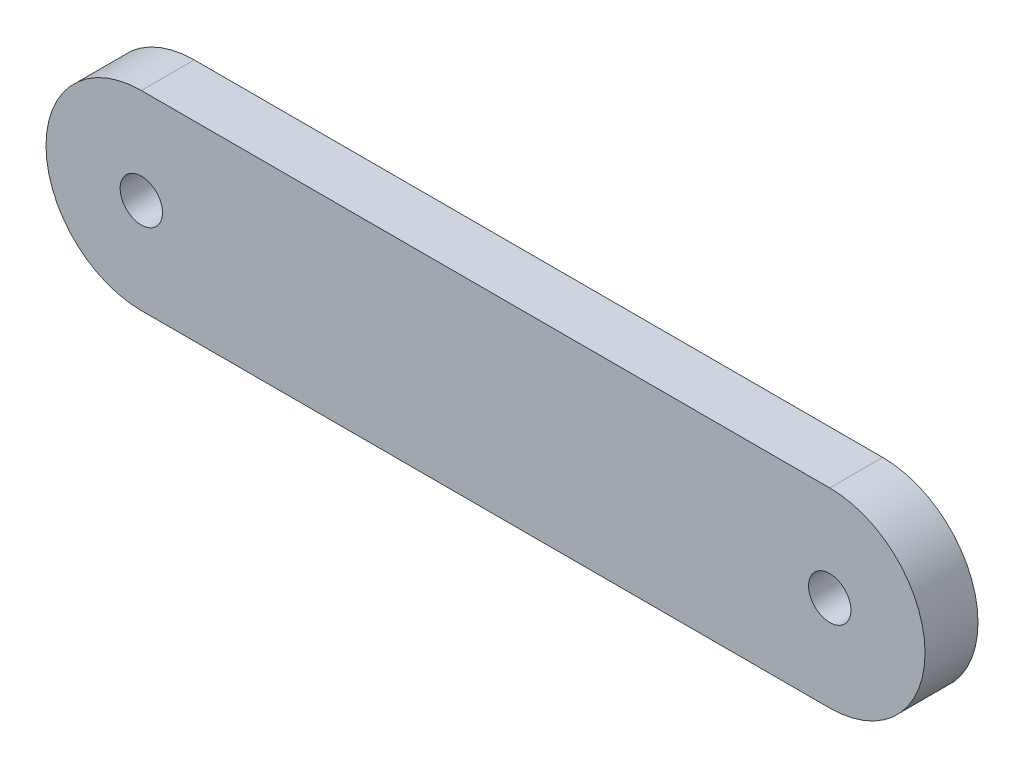
ISO-10303-21;
HEADER;
FILE_DESCRIPTION(('STEP AP214'),'2;1');
FILE_NAME('part.step','',(''),(''),'','','');
FILE_SCHEMA(('AUTOMOTIVE_DESIGN { 1 0 10303 214 1 1 1 1 }'));
ENDSEC;
DATA;
#1=APPLICATION_CONTEXT('core data for automotive mechanical design processes');
#2=APPLICATION_PROTOCOL_DEFINITION('international standard','automotive_design',2000,#1);
#3=PRODUCT_CONTEXT('',#1,'mechanical');
#4=PRODUCT('Part','Part','',(#3));
#5=PRODUCT_RELATED_PRODUCT_CATEGORY('part','',(#4));
#6=PRODUCT_DEFINITION_FORMATION('','',#4);
#7=PRODUCT_DEFINITION_CONTEXT('part definition',#1,'design');
#8=PRODUCT_DEFINITION('design','',#6,#7);
#9=PRODUCT_DEFINITION_SHAPE('','',#8);
#10=(LENGTH_UNIT() NAMED_UNIT(*) SI_UNIT(.MILLI.,.METRE.));
#11=(NAMED_UNIT(*) PLANE_ANGLE_UNIT() SI_UNIT($,.RADIAN.));
#12=(NAMED_UNIT(*) SI_UNIT($,.STERADIAN.) SOLID_ANGLE_UNIT());
#13=UNCERTAINTY_MEASURE_WITH_UNIT(LENGTH_MEASURE(1.E-05),#10,'distance_accuracy_value','');
#14=(GEOMETRIC_REPRESENTATION_CONTEXT(3) GLOBAL_UNCERTAINTY_ASSIGNED_CONTEXT((#13)) GLOBAL_UNIT_ASSIGNED_CONTEXT((#10,
#11,#12)) REPRESENTATION_CONTEXT('',''));
#15=CARTESIAN_POINT('',(0.,0.,0.));
#16=DIRECTION('',(0.,0.,1.));
#17=DIRECTION('',(1.,0.,0.));
#18=AXIS2_PLACEMENT_3D('',#15,#16,#17);
#19=CARTESIAN_POINT('',(0.,0.,5.));
#20=DIRECTION('',(0.,0.,1.));
#21=DIRECTION('',(1.,0.,0.));
#22=AXIS2_PLACEMENT_3D('',#19,#20,#21);
#23=PLANE('',#22);
#24=CARTESIAN_POINT('',(0.,0.,5.));
#25=DIRECTION('',(0.,0.,1.));
#26=DIRECTION('',(1.,0.,0.));
#27=AXIS2_PLACEMENT_3D('',#24,#25,#26);
#28=CIRCLE('',#27,2.);
#29=CARTESIAN_POINT('',(2.,0.,5.));
#30=VERTEX_POINT('',#29);
#31=EDGE_CURVE('E100',#30,#30,#28,.T.);
#32=ORIENTED_EDGE('',*,*,#31,.F.);
#33=EDGE_LOOP('',(#32));
#34=FACE_BOUND('',#33,.T.);
#35=CARTESIAN_POINT('',(0.,0.,5.));
#36=DIRECTION('',(0.,0.,1.));
#37=DIRECTION('',(1.,0.,0.));
#38=AXIS2_PLACEMENT_3D('',#35,#36,#37);
#39=CIRCLE('',#38,9.);
#40=CARTESIAN_POINT('',(0.,9.,5.));
#41=VERTEX_POINT('',#40);
#42=CARTESIAN_POINT('',(0.,-9.,5.));
#43=VERTEX_POINT('',#42);
#44=EDGE_CURVE('E85',#41,#43,#39,.T.);
#45=ORIENTED_EDGE('',*,*,#44,.T.);
#46=DIRECTION('',(1.,0.,0.));
#47=VECTOR('',#46,1.);
#48=CARTESIAN_POINT('',(0.,-9.,5.));
#49=LINE('',#48,#47);
#50=CARTESIAN_POINT('',(65.,-9.,5.));
#51=VERTEX_POINT('',#50);
#52=EDGE_CURVE('E80',#43,#51,#49,.T.);
#53=ORIENTED_EDGE('',*,*,#52,.T.);
#54=CARTESIAN_POINT('',(65.,0.,5.));
#55=DIRECTION('',(0.,0.,1.));
#56=DIRECTION('',(1.,0.,0.));
#57=AXIS2_PLACEMENT_3D('',#54,#55,#56);
#58=CIRCLE('',#57,9.);
#59=CARTESIAN_POINT('',(65.,9.,5.));
#60=VERTEX_POINT('',#59);
#61=EDGE_CURVE('E83',#51,#60,#58,.T.);
#62=ORIENTED_EDGE('',*,*,#61,.T.);
#63=DIRECTION('',(-1.,0.,0.));
#64=VECTOR('',#63,1.);
#65=CARTESIAN_POINT('',(0.,9.,5.));
#66=LINE('',#65,#64);
#67=EDGE_CURVE('E50',#60,#41,#66,.T.);
#68=ORIENTED_EDGE('',*,*,#67,.T.);
#69=EDGE_LOOP('',(#45,#53,#62,#68));
#70=FACE_BOUND('',#69,.T.);
#71=CARTESIAN_POINT('',(65.,0.,5.));
#72=DIRECTION('',(0.,0.,1.));
#73=DIRECTION('',(1.,0.,0.));
#74=AXIS2_PLACEMENT_3D('',#71,#72,#73);
#75=CIRCLE('',#74,2.);
#76=CARTESIAN_POINT('',(67.,0.,5.));
#77=VERTEX_POINT('',#76);
#78=EDGE_CURVE('E115',#77,#77,#75,.T.);
#79=ORIENTED_EDGE('',*,*,#78,.F.);
#80=EDGE_LOOP('',(#79));
#81=FACE_BOUND('',#80,.T.);
#82=ADVANCED_FACE('F33',(#34,#70,#81),#23,.T.);
#83=CARTESIAN_POINT('',(0.,0.,0.));
#84=DIRECTION('',(0.,0.,1.));
#85=DIRECTION('',(1.,0.,0.));
#86=AXIS2_PLACEMENT_3D('',#83,#84,#85);
#87=PLANE('',#86);
#88=CARTESIAN_POINT('',(0.,0.,0.));
#89=DIRECTION('',(0.,0.,1.));
#90=DIRECTION('',(1.,0.,0.));
#91=AXIS2_PLACEMENT_3D('',#88,#89,#90);
#92=CIRCLE('',#91,2.);
#93=CARTESIAN_POINT('',(2.,0.,0.));
#94=VERTEX_POINT('',#93);
#95=EDGE_CURVE('E112',#94,#94,#92,.T.);
#96=ORIENTED_EDGE('',*,*,#95,.T.);
#97=EDGE_LOOP('',(#96));
#98=FACE_BOUND('',#97,.T.);
#99=CARTESIAN_POINT('',(0.,0.,0.));
#100=DIRECTION('',(0.,0.,1.));
#101=DIRECTION('',(1.,0.,0.));
#102=AXIS2_PLACEMENT_3D('',#99,#100,#101);
#103=CIRCLE('',#102,9.);
#104=CARTESIAN_POINT('',(0.,9.,0.));
#105=VERTEX_POINT('',#104);
#106=CARTESIAN_POINT('',(0.,-9.,0.));
#107=VERTEX_POINT('',#106);
#108=EDGE_CURVE('E97',#105,#107,#103,.T.);
#109=ORIENTED_EDGE('',*,*,#108,.F.);
#110=DIRECTION('',(-1.,0.,0.));
#111=VECTOR('',#110,1.);
#112=CARTESIAN_POINT('',(0.,9.,0.));
#113=LINE('',#112,#111);
#114=CARTESIAN_POINT('',(65.,9.,0.));
#115=VERTEX_POINT('',#114);
#116=EDGE_CURVE('E73',#115,#105,#113,.T.);
#117=ORIENTED_EDGE('',*,*,#116,.F.);
#118=CARTESIAN_POINT('',(65.,0.,0.));
#119=DIRECTION('',(0.,0.,1.));
#120=DIRECTION('',(1.,0.,0.));
#121=AXIS2_PLACEMENT_3D('',#118,#119,#120);
#122=CIRCLE('',#121,9.);
#123=CARTESIAN_POINT('',(65.,-9.,0.));
#124=VERTEX_POINT('',#123);
#125=EDGE_CURVE('E67',#124,#115,#122,.T.);
#126=ORIENTED_EDGE('',*,*,#125,.F.);
#127=DIRECTION('',(1.,0.,0.));
#128=VECTOR('',#127,1.);
#129=CARTESIAN_POINT('',(0.,-9.,0.));
#130=LINE('',#129,#128);
#131=EDGE_CURVE('E89',#107,#124,#130,.T.);
#132=ORIENTED_EDGE('',*,*,#131,.F.);
#133=EDGE_LOOP('',(#109,#117,#126,#132));
#134=FACE_BOUND('',#133,.T.);
#135=CARTESIAN_POINT('',(65.,0.,0.));
#136=DIRECTION('',(0.,0.,1.));
#137=DIRECTION('',(1.,0.,0.));
#138=AXIS2_PLACEMENT_3D('',#135,#136,#137);
#139=CIRCLE('',#138,2.);
#140=CARTESIAN_POINT('',(67.,0.,0.));
#141=VERTEX_POINT('',#140);
#142=EDGE_CURVE('E118',#141,#141,#139,.T.);
#143=ORIENTED_EDGE('',*,*,#142,.T.);
#144=EDGE_LOOP('',(#143));
#145=FACE_BOUND('',#144,.T.);
#146=ADVANCED_FACE('F108',(#98,#134,#145),#87,.F.);
#147=CARTESIAN_POINT('',(0.,0.,5.));
#148=DIRECTION('',(0.,0.,-1.));
#149=DIRECTION('',(-1.,0.,0.));
#150=AXIS2_PLACEMENT_3D('',#147,#148,#149);
#151=CYLINDRICAL_SURFACE('',#150,9.);
#152=ORIENTED_EDGE('',*,*,#108,.T.);
#153=DIRECTION('',(0.,0.,-1.));
#154=VECTOR('',#153,1.);
#155=CARTESIAN_POINT('',(0.,-9.,5.));
#156=LINE('',#155,#154);
#157=EDGE_CURVE('E11',#43,#107,#156,.T.);
#158=ORIENTED_EDGE('',*,*,#157,.F.);
#159=ORIENTED_EDGE('',*,*,#44,.F.);
#160=DIRECTION('',(0.,0.,-1.));
#161=VECTOR('',#160,1.);
#162=CARTESIAN_POINT('',(0.,9.,5.));
#163=LINE('',#162,#161);
#164=EDGE_CURVE('E93',#41,#105,#163,.T.);
#165=ORIENTED_EDGE('',*,*,#164,.T.);
#166=EDGE_LOOP('',(#152,#158,#159,#165));
#167=FACE_BOUND('',#166,.T.);
#168=ADVANCED_FACE('F35',(#167),#151,.T.);
#169=CARTESIAN_POINT('',(0.,-9.,5.));
#170=DIRECTION('',(0.,1.,0.));
#171=DIRECTION('',(0.,0.,1.));
#172=AXIS2_PLACEMENT_3D('',#169,#170,#171);
#173=PLANE('',#172);
#174=ORIENTED_EDGE('',*,*,#131,.T.);
#175=DIRECTION('',(0.,0.,-1.));
#176=VECTOR('',#175,1.);
#177=CARTESIAN_POINT('',(65.,-9.,5.));
#178=LINE('',#177,#176);
#179=EDGE_CURVE('E42',#51,#124,#178,.T.);
#180=ORIENTED_EDGE('',*,*,#179,.F.);
#181=ORIENTED_EDGE('',*,*,#52,.F.);
#182=ORIENTED_EDGE('',*,*,#157,.T.);
#183=EDGE_LOOP('',(#174,#180,#181,#182));
#184=FACE_BOUND('',#183,.T.);
#185=ADVANCED_FACE('F88',(#184),#173,.F.);
#186=CARTESIAN_POINT('',(65.,0.,5.));
#187=DIRECTION('',(0.,0.,-1.));
#188=DIRECTION('',(-1.,0.,0.));
#189=AXIS2_PLACEMENT_3D('',#186,#187,#188);
#190=CYLINDRICAL_SURFACE('',#189,9.);
#191=ORIENTED_EDGE('',*,*,#125,.T.);
#192=DIRECTION('',(0.,0.,-1.));
#193=VECTOR('',#192,1.);
#194=CARTESIAN_POINT('',(65.,9.,5.));
#195=LINE('',#194,#193);
#196=EDGE_CURVE('E90',#60,#115,#195,.T.);
#197=ORIENTED_EDGE('',*,*,#196,.F.);
#198=ORIENTED_EDGE('',*,*,#61,.F.);
#199=ORIENTED_EDGE('',*,*,#179,.T.);
#200=EDGE_LOOP('',(#191,#197,#198,#199));
#201=FACE_BOUND('',#200,.T.);
#202=ADVANCED_FACE('F91',(#201),#190,.T.);
#203=CARTESIAN_POINT('',(0.,9.,5.));
#204=DIRECTION('',(0.,-1.,0.));
#205=DIRECTION('',(0.,0.,-1.));
#206=AXIS2_PLACEMENT_3D('',#203,#204,#205);
#207=PLANE('',#206);
#208=ORIENTED_EDGE('',*,*,#116,.T.);
#209=ORIENTED_EDGE('',*,*,#164,.F.);
#210=ORIENTED_EDGE('',*,*,#67,.F.);
#211=ORIENTED_EDGE('',*,*,#196,.T.);
#212=EDGE_LOOP('',(#208,#209,#210,#211));
#213=FACE_BOUND('',#212,.T.);
#214=ADVANCED_FACE('F105',(#213),#207,.F.);
#215=CARTESIAN_POINT('',(0.,0.,5.));
#216=DIRECTION('',(0.,0.,-1.));
#217=DIRECTION('',(-1.,0.,0.));
#218=AXIS2_PLACEMENT_3D('',#215,#216,#217);
#219=CYLINDRICAL_SURFACE('',#218,2.);
#220=ORIENTED_EDGE('',*,*,#31,.T.);
#221=EDGE_LOOP('',(#220));
#222=FACE_BOUND('',#221,.T.);
#223=ORIENTED_EDGE('',*,*,#95,.F.);
#224=EDGE_LOOP('',(#223));
#225=FACE_BOUND('',#224,.T.);
#226=ADVANCED_FACE('F136',(#222,#225),#219,.F.);
#227=CARTESIAN_POINT('',(65.,0.,5.));
#228=DIRECTION('',(0.,0.,-1.));
#229=DIRECTION('',(-1.,0.,0.));
#230=AXIS2_PLACEMENT_3D('',#227,#228,#229);
#231=CYLINDRICAL_SURFACE('',#230,2.);
#232=ORIENTED_EDGE('',*,*,#78,.T.);
#233=EDGE_LOOP('',(#232));
#234=FACE_BOUND('',#233,.T.);
#235=ORIENTED_EDGE('',*,*,#142,.F.);
#236=EDGE_LOOP('',(#235));
#237=FACE_BOUND('',#236,.T.);
#238=ADVANCED_FACE('F124',(#234,#237),#231,.F.);
#239=CLOSED_SHELL('',(#82,#146,#168,#185,#202,#214,#226,#238));
#240=MANIFOLD_SOLID_BREP('B2',#239);
#241=ADVANCED_BREP_SHAPE_REPRESENTATION('',(#18,#240),#14);
#242=SHAPE_DEFINITION_REPRESENTATION(#9,#241);
ENDSEC;
END-ISO-10303-21;
